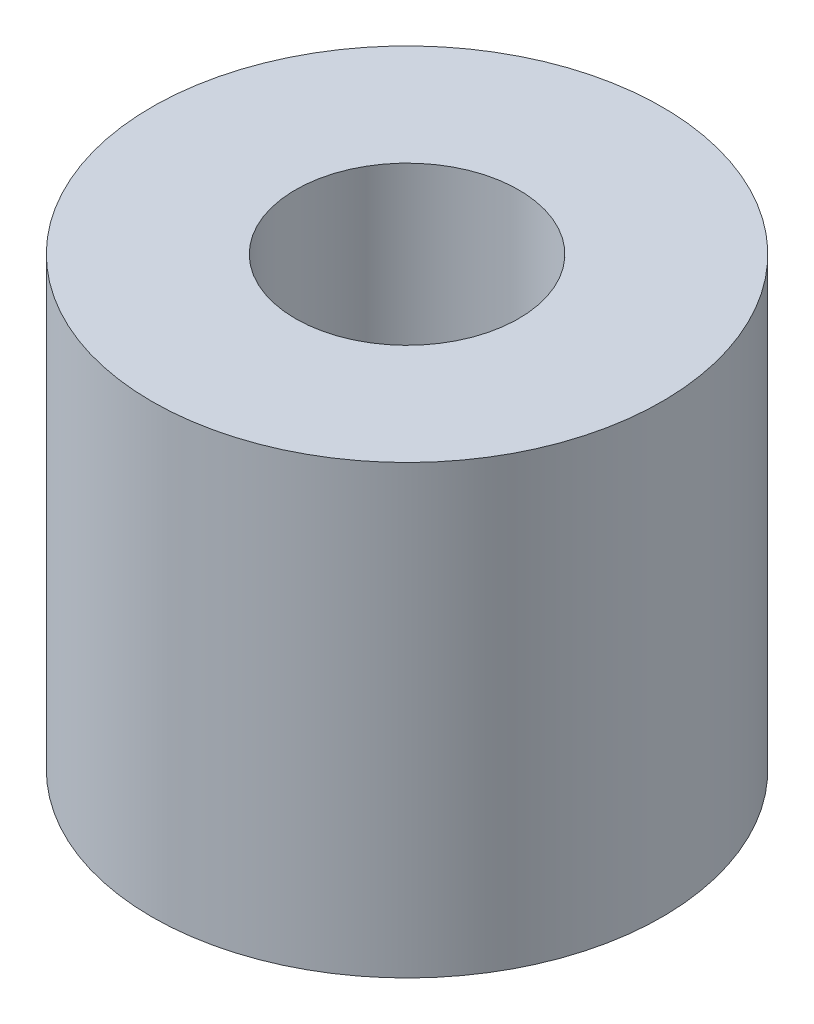
ISO-10303-21;
HEADER;
FILE_DESCRIPTION(('STEP AP214'),'2;1');
FILE_NAME('part.step','',(''),(''),'','','');
FILE_SCHEMA(('AUTOMOTIVE_DESIGN { 1 0 10303 214 1 1 1 1 }'));
ENDSEC;
DATA;
#1=APPLICATION_CONTEXT('core data for automotive mechanical design processes');
#2=APPLICATION_PROTOCOL_DEFINITION('international standard','automotive_design',2000,#1);
#3=PRODUCT_CONTEXT('',#1,'mechanical');
#4=PRODUCT('Part','Part','',(#3));
#5=PRODUCT_RELATED_PRODUCT_CATEGORY('part','',(#4));
#6=PRODUCT_DEFINITION_FORMATION('','',#4);
#7=PRODUCT_DEFINITION_CONTEXT('part definition',#1,'design');
#8=PRODUCT_DEFINITION('design','',#6,#7);
#9=PRODUCT_DEFINITION_SHAPE('','',#8);
#10=(LENGTH_UNIT() NAMED_UNIT(*) SI_UNIT(.MILLI.,.METRE.));
#11=(NAMED_UNIT(*) PLANE_ANGLE_UNIT() SI_UNIT($,.RADIAN.));
#12=(NAMED_UNIT(*) SI_UNIT($,.STERADIAN.) SOLID_ANGLE_UNIT());
#13=UNCERTAINTY_MEASURE_WITH_UNIT(LENGTH_MEASURE(1.E-05),#10,'distance_accuracy_value','');
#14=(GEOMETRIC_REPRESENTATION_CONTEXT(3) GLOBAL_UNCERTAINTY_ASSIGNED_CONTEXT((#13)) GLOBAL_UNIT_ASSIGNED_CONTEXT((#10,
#11,#12)) REPRESENTATION_CONTEXT('',''));
#15=CARTESIAN_POINT('',(0.,0.,0.));
#16=DIRECTION('',(0.,0.,1.));
#17=DIRECTION('',(1.,0.,0.));
#18=AXIS2_PLACEMENT_3D('',#15,#16,#17);
#19=CARTESIAN_POINT('',(0.,7.,0.));
#20=DIRECTION('',(0.,1.,0.));
#21=DIRECTION('',(0.,0.,1.));
#22=AXIS2_PLACEMENT_3D('',#19,#20,#21);
#23=PLANE('',#22);
#24=CARTESIAN_POINT('',(0.,7.,0.));
#25=DIRECTION('',(0.,1.,0.));
#26=DIRECTION('',(0.,0.,1.));
#27=AXIS2_PLACEMENT_3D('',#24,#25,#26);
#28=CIRCLE('',#27,4.);
#29=CARTESIAN_POINT('',(0.,7.,4.));
#30=VERTEX_POINT('',#29);
#31=EDGE_CURVE('E10',#30,#30,#28,.T.);
#32=ORIENTED_EDGE('',*,*,#31,.T.);
#33=EDGE_LOOP('',(#32));
#34=FACE_BOUND('',#33,.T.);
#35=CARTESIAN_POINT('',(0.,7.,0.));
#36=DIRECTION('',(0.,1.,0.));
#37=DIRECTION('',(0.,0.,1.));
#38=AXIS2_PLACEMENT_3D('',#35,#36,#37);
#39=CIRCLE('',#38,1.75);
#40=CARTESIAN_POINT('',(0.,7.,1.75));
#41=VERTEX_POINT('',#40);
#42=EDGE_CURVE('E43',#41,#41,#39,.T.);
#43=ORIENTED_EDGE('',*,*,#42,.F.);
#44=EDGE_LOOP('',(#43));
#45=FACE_BOUND('',#44,.T.);
#46=ADVANCED_FACE('F32',(#34,#45),#23,.T.);
#47=CARTESIAN_POINT('',(0.,0.,0.));
#48=DIRECTION('',(0.,1.,0.));
#49=DIRECTION('',(0.,0.,1.));
#50=AXIS2_PLACEMENT_3D('',#47,#48,#49);
#51=PLANE('',#50);
#52=CARTESIAN_POINT('',(0.,0.,0.));
#53=DIRECTION('',(0.,1.,0.));
#54=DIRECTION('',(0.,0.,1.));
#55=AXIS2_PLACEMENT_3D('',#52,#53,#54);
#56=CIRCLE('',#55,4.);
#57=CARTESIAN_POINT('',(0.,0.,4.));
#58=VERTEX_POINT('',#57);
#59=EDGE_CURVE('E36',#58,#58,#56,.T.);
#60=ORIENTED_EDGE('',*,*,#59,.F.);
#61=EDGE_LOOP('',(#60));
#62=FACE_BOUND('',#61,.T.);
#63=CARTESIAN_POINT('',(0.,0.,0.));
#64=DIRECTION('',(0.,1.,0.));
#65=DIRECTION('',(0.,0.,1.));
#66=AXIS2_PLACEMENT_3D('',#63,#64,#65);
#67=CIRCLE('',#66,1.75);
#68=CARTESIAN_POINT('',(0.,0.,1.75));
#69=VERTEX_POINT('',#68);
#70=EDGE_CURVE('E45',#69,#69,#67,.T.);
#71=ORIENTED_EDGE('',*,*,#70,.T.);
#72=EDGE_LOOP('',(#71));
#73=FACE_BOUND('',#72,.T.);
#74=ADVANCED_FACE('F55',(#62,#73),#51,.F.);
#75=CARTESIAN_POINT('',(0.,7.,0.));
#76=DIRECTION('',(0.,-1.,0.));
#77=DIRECTION('',(0.,0.,-1.));
#78=AXIS2_PLACEMENT_3D('',#75,#76,#77);
#79=CYLINDRICAL_SURFACE('',#78,4.);
#80=ORIENTED_EDGE('',*,*,#31,.F.);
#81=EDGE_LOOP('',(#80));
#82=FACE_BOUND('',#81,.T.);
#83=ORIENTED_EDGE('',*,*,#59,.T.);
#84=EDGE_LOOP('',(#83));
#85=FACE_BOUND('',#84,.T.);
#86=ADVANCED_FACE('F34',(#82,#85),#79,.T.);
#87=CARTESIAN_POINT('',(0.,7.,0.));
#88=DIRECTION('',(0.,-1.,0.));
#89=DIRECTION('',(0.,0.,-1.));
#90=AXIS2_PLACEMENT_3D('',#87,#88,#89);
#91=CYLINDRICAL_SURFACE('',#90,1.75);
#92=ORIENTED_EDGE('',*,*,#42,.T.);
#93=EDGE_LOOP('',(#92));
#94=FACE_BOUND('',#93,.T.);
#95=ORIENTED_EDGE('',*,*,#70,.F.);
#96=EDGE_LOOP('',(#95));
#97=FACE_BOUND('',#96,.T.);
#98=ADVANCED_FACE('F51',(#94,#97),#91,.F.);
#99=CLOSED_SHELL('',(#46,#74,#86,#98));
#100=MANIFOLD_SOLID_BREP('B2',#99);
#101=ADVANCED_BREP_SHAPE_REPRESENTATION('',(#18,#100),#14);
#102=SHAPE_DEFINITION_REPRESENTATION(#9,#101);
ENDSEC;
END-ISO-10303-21;
